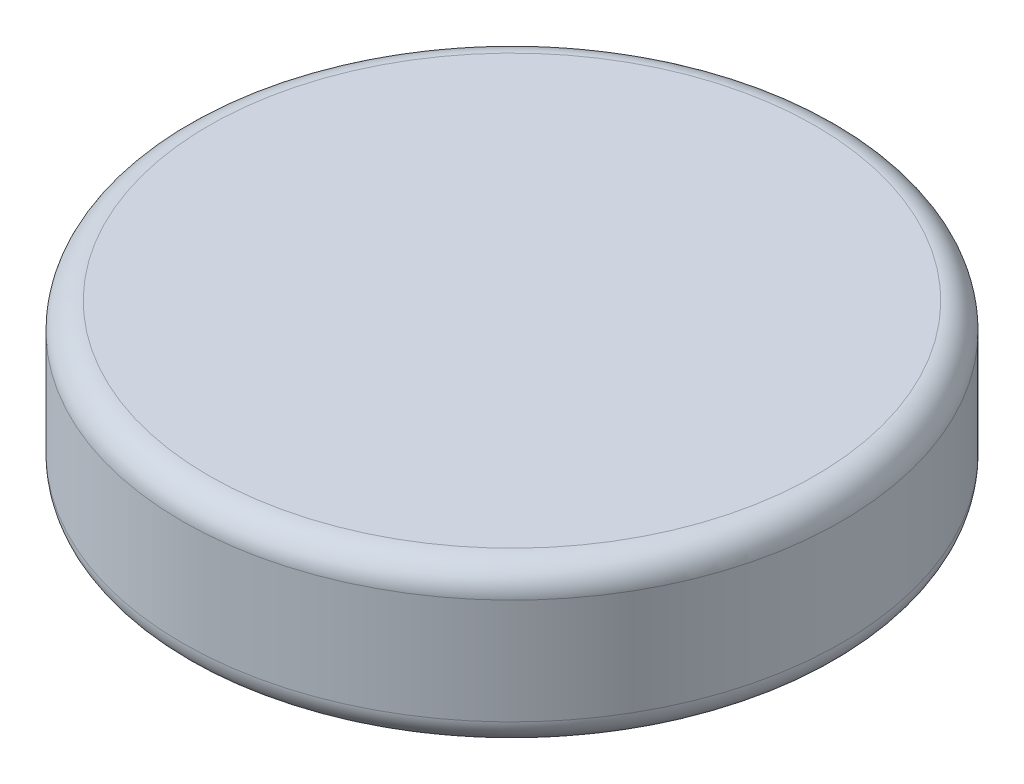
ISO-10303-21;
HEADER;
FILE_DESCRIPTION(('STEP AP214'),'2;1');
FILE_NAME('part.step','',(''),(''),'','','');
FILE_SCHEMA(('AUTOMOTIVE_DESIGN { 1 0 10303 214 1 1 1 1 }'));
ENDSEC;
DATA;
#1=APPLICATION_CONTEXT('core data for automotive mechanical design processes');
#2=APPLICATION_PROTOCOL_DEFINITION('international standard','automotive_design',2000,#1);
#3=PRODUCT_CONTEXT('',#1,'mechanical');
#4=PRODUCT('Part','Part','',(#3));
#5=PRODUCT_RELATED_PRODUCT_CATEGORY('part','',(#4));
#6=PRODUCT_DEFINITION_FORMATION('','',#4);
#7=PRODUCT_DEFINITION_CONTEXT('part definition',#1,'design');
#8=PRODUCT_DEFINITION('design','',#6,#7);
#9=PRODUCT_DEFINITION_SHAPE('','',#8);
#10=(LENGTH_UNIT() NAMED_UNIT(*) SI_UNIT(.MILLI.,.METRE.));
#11=(NAMED_UNIT(*) PLANE_ANGLE_UNIT() SI_UNIT($,.RADIAN.));
#12=(NAMED_UNIT(*) SI_UNIT($,.STERADIAN.) SOLID_ANGLE_UNIT());
#13=UNCERTAINTY_MEASURE_WITH_UNIT(LENGTH_MEASURE(1.E-05),#10,'distance_accuracy_value','');
#14=(GEOMETRIC_REPRESENTATION_CONTEXT(3) GLOBAL_UNCERTAINTY_ASSIGNED_CONTEXT((#13)) GLOBAL_UNIT_ASSIGNED_CONTEXT((#10,
#11,#12)) REPRESENTATION_CONTEXT('',''));
#15=CARTESIAN_POINT('',(0.,0.,0.));
#16=DIRECTION('',(0.,0.,1.));
#17=DIRECTION('',(1.,0.,0.));
#18=AXIS2_PLACEMENT_3D('',#15,#16,#17);
#19=CARTESIAN_POINT('',(0.,32.5628,0.));
#20=DIRECTION('',(0.,1.,0.));
#21=DIRECTION('',(1.,0.,0.));
#22=AXIS2_PLACEMENT_3D('',#19,#20,#21);
#23=PLANE('',#22);
#24=CARTESIAN_POINT('',(0.,32.5628,0.));
#25=DIRECTION('',(0.,-1.,0.));
#26=DIRECTION('',(0.,0.,1.));
#27=AXIS2_PLACEMENT_3D('',#24,#25,#26);
#28=CIRCLE('',#27,2.9209886407761);
#29=CARTESIAN_POINT('',(0.,32.5628,2.9209886407761));
#30=VERTEX_POINT('',#29);
#31=EDGE_CURVE('E38',#30,#30,#28,.T.);
#32=ORIENTED_EDGE('',*,*,#31,.T.);
#33=EDGE_LOOP('',(#32));
#34=FACE_BOUND('',#33,.T.);
#35=ADVANCED_FACE('F15',(#34),#23,.F.);
#36=CARTESIAN_POINT('',(0.,32.8168,0.));
#37=DIRECTION('',(0.,1.,0.));
#38=DIRECTION('',(0.,0.,1.));
#39=AXIS2_PLACEMENT_3D('',#36,#37,#38);
#40=TOROIDAL_SURFACE('',#39,2.921,0.254);
#41=CARTESIAN_POINT('',(0.,32.816800000254,0.));
#42=DIRECTION('',(0.,1.,0.));
#43=DIRECTION('',(0.,0.,1.));
#44=AXIS2_PLACEMENT_3D('',#41,#42,#43);
#45=CIRCLE('',#44,3.175);
#46=CARTESIAN_POINT('',(0.,32.816800000254,3.175));
#47=VERTEX_POINT('',#46);
#48=EDGE_CURVE('E31',#47,#47,#45,.T.);
#49=ORIENTED_EDGE('',*,*,#48,.F.);
#50=EDGE_LOOP('',(#49));
#51=FACE_BOUND('',#50,.T.);
#52=ORIENTED_EDGE('',*,*,#31,.F.);
#53=EDGE_LOOP('',(#52));
#54=FACE_BOUND('',#53,.T.);
#55=ADVANCED_FACE('F48',(#51,#54),#40,.T.);
#56=CARTESIAN_POINT('',(0.,34.0868,0.));
#57=DIRECTION('',(0.,1.,0.));
#58=DIRECTION('',(0.,0.,-1.));
#59=AXIS2_PLACEMENT_3D('',#56,#57,#58);
#60=CYLINDRICAL_SURFACE('',#59,3.175);
#61=ORIENTED_EDGE('',*,*,#48,.T.);
#62=EDGE_LOOP('',(#61));
#63=FACE_BOUND('',#62,.T.);
#64=CARTESIAN_POINT('',(0.,33.832800000254,0.));
#65=DIRECTION('',(0.,-1.,0.));
#66=DIRECTION('',(0.,0.,1.));
#67=AXIS2_PLACEMENT_3D('',#64,#65,#66);
#68=CIRCLE('',#67,3.175);
#69=CARTESIAN_POINT('',(0.,33.832800000254,3.175));
#70=VERTEX_POINT('',#69);
#71=EDGE_CURVE('E23',#70,#70,#68,.T.);
#72=ORIENTED_EDGE('',*,*,#71,.T.);
#73=EDGE_LOOP('',(#72));
#74=FACE_BOUND('',#73,.T.);
#75=ADVANCED_FACE('F50',(#63,#74),#60,.T.);
#76=CARTESIAN_POINT('',(0.,33.8328,0.));
#77=DIRECTION('',(0.,1.,0.));
#78=DIRECTION('',(0.,0.,1.));
#79=AXIS2_PLACEMENT_3D('',#76,#77,#78);
#80=TOROIDAL_SURFACE('',#79,2.921,0.254);
#81=CARTESIAN_POINT('',(0.,34.0868,0.));
#82=DIRECTION('',(0.,1.,0.));
#83=DIRECTION('',(0.,0.,1.));
#84=AXIS2_PLACEMENT_3D('',#81,#82,#83);
#85=CIRCLE('',#84,2.921);
#86=CARTESIAN_POINT('',(0.,34.0868,2.921));
#87=VERTEX_POINT('',#86);
#88=EDGE_CURVE('E10',#87,#87,#85,.T.);
#89=ORIENTED_EDGE('',*,*,#88,.F.);
#90=EDGE_LOOP('',(#89));
#91=FACE_BOUND('',#90,.T.);
#92=ORIENTED_EDGE('',*,*,#71,.F.);
#93=EDGE_LOOP('',(#92));
#94=FACE_BOUND('',#93,.T.);
#95=ADVANCED_FACE('F58',(#91,#94),#80,.T.);
#96=CARTESIAN_POINT('',(0.,34.0868,0.));
#97=DIRECTION('',(0.,1.,0.));
#98=DIRECTION('',(1.,0.,0.));
#99=AXIS2_PLACEMENT_3D('',#96,#97,#98);
#100=PLANE('',#99);
#101=ORIENTED_EDGE('',*,*,#88,.T.);
#102=EDGE_LOOP('',(#101));
#103=FACE_BOUND('',#102,.T.);
#104=ADVANCED_FACE('F17',(#103),#100,.T.);
#105=CLOSED_SHELL('',(#35,#55,#75,#95,#104));
#106=MANIFOLD_SOLID_BREP('B1',#105);
#107=ADVANCED_BREP_SHAPE_REPRESENTATION('',(#18,#106),#14);
#108=SHAPE_DEFINITION_REPRESENTATION(#9,#107);
ENDSEC;
END-ISO-10303-21;
